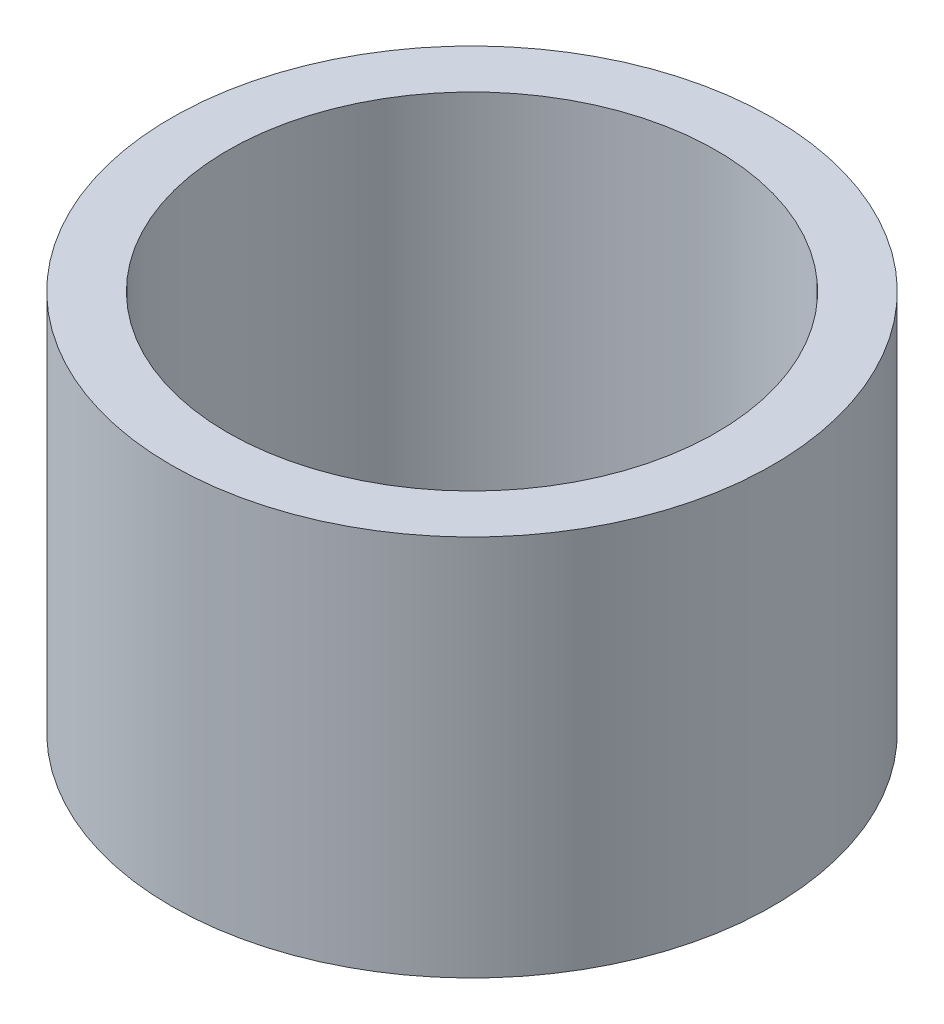
ISO-10303-21;
HEADER;
FILE_DESCRIPTION(('STEP AP214'),'2;1');
FILE_NAME('part.step','',(''),(''),'','','');
FILE_SCHEMA(('AUTOMOTIVE_DESIGN { 1 0 10303 214 1 1 1 1 }'));
ENDSEC;
DATA;
#1=APPLICATION_CONTEXT('core data for automotive mechanical design processes');
#2=APPLICATION_PROTOCOL_DEFINITION('international standard','automotive_design',2000,#1);
#3=PRODUCT_CONTEXT('',#1,'mechanical');
#4=PRODUCT('Part','Part','',(#3));
#5=PRODUCT_RELATED_PRODUCT_CATEGORY('part','',(#4));
#6=PRODUCT_DEFINITION_FORMATION('','',#4);
#7=PRODUCT_DEFINITION_CONTEXT('part definition',#1,'design');
#8=PRODUCT_DEFINITION('design','',#6,#7);
#9=PRODUCT_DEFINITION_SHAPE('','',#8);
#10=(LENGTH_UNIT() NAMED_UNIT(*) SI_UNIT(.MILLI.,.METRE.));
#11=(NAMED_UNIT(*) PLANE_ANGLE_UNIT() SI_UNIT($,.RADIAN.));
#12=(NAMED_UNIT(*) SI_UNIT($,.STERADIAN.) SOLID_ANGLE_UNIT());
#13=UNCERTAINTY_MEASURE_WITH_UNIT(LENGTH_MEASURE(1.E-05),#10,'distance_accuracy_value','');
#14=(GEOMETRIC_REPRESENTATION_CONTEXT(3) GLOBAL_UNCERTAINTY_ASSIGNED_CONTEXT((#13)) GLOBAL_UNIT_ASSIGNED_CONTEXT((#10,
#11,#12)) REPRESENTATION_CONTEXT('',''));
#15=CARTESIAN_POINT('',(0.,0.,0.));
#16=DIRECTION('',(0.,0.,1.));
#17=DIRECTION('',(1.,0.,0.));
#18=AXIS2_PLACEMENT_3D('',#15,#16,#17);
#19=CARTESIAN_POINT('',(0.,3.175,0.));
#20=DIRECTION('',(0.,1.,0.));
#21=DIRECTION('',(0.,0.,1.));
#22=AXIS2_PLACEMENT_3D('',#19,#20,#21);
#23=PLANE('',#22);
#24=CARTESIAN_POINT('',(0.,3.175,0.));
#25=DIRECTION('',(0.,1.,0.));
#26=DIRECTION('',(0.,0.,1.));
#27=AXIS2_PLACEMENT_3D('',#24,#25,#26);
#28=CIRCLE('',#27,5.);
#29=CARTESIAN_POINT('',(0.,3.175,5.));
#30=VERTEX_POINT('',#29);
#31=EDGE_CURVE('E10',#30,#30,#28,.T.);
#32=ORIENTED_EDGE('',*,*,#31,.T.);
#33=EDGE_LOOP('',(#32));
#34=FACE_BOUND('',#33,.T.);
#35=CARTESIAN_POINT('',(0.,3.175,0.));
#36=DIRECTION('',(0.,1.,0.));
#37=DIRECTION('',(0.,0.,1.));
#38=AXIS2_PLACEMENT_3D('',#35,#36,#37);
#39=CIRCLE('',#38,4.0635);
#40=CARTESIAN_POINT('',(0.,3.175,4.0635));
#41=VERTEX_POINT('',#40);
#42=EDGE_CURVE('E50',#41,#41,#39,.T.);
#43=ORIENTED_EDGE('',*,*,#42,.F.);
#44=EDGE_LOOP('',(#43));
#45=FACE_BOUND('',#44,.T.);
#46=ADVANCED_FACE('F37',(#34,#45),#23,.T.);
#47=CARTESIAN_POINT('',(0.,-3.175,0.));
#48=DIRECTION('',(0.,1.,0.));
#49=DIRECTION('',(0.,0.,1.));
#50=AXIS2_PLACEMENT_3D('',#47,#48,#49);
#51=PLANE('',#50);
#52=CARTESIAN_POINT('',(0.,-3.175,0.));
#53=DIRECTION('',(0.,1.,0.));
#54=DIRECTION('',(0.,0.,1.));
#55=AXIS2_PLACEMENT_3D('',#52,#53,#54);
#56=CIRCLE('',#55,5.);
#57=CARTESIAN_POINT('',(0.,-3.175,5.));
#58=VERTEX_POINT('',#57);
#59=EDGE_CURVE('E41',#58,#58,#56,.T.);
#60=ORIENTED_EDGE('',*,*,#59,.F.);
#61=EDGE_LOOP('',(#60));
#62=FACE_BOUND('',#61,.T.);
#63=CARTESIAN_POINT('',(0.,-3.175,0.));
#64=DIRECTION('',(0.,1.,0.));
#65=DIRECTION('',(0.,0.,1.));
#66=AXIS2_PLACEMENT_3D('',#63,#64,#65);
#67=CIRCLE('',#66,4.0635);
#68=CARTESIAN_POINT('',(0.,-3.175,4.0635));
#69=VERTEX_POINT('',#68);
#70=EDGE_CURVE('E52',#69,#69,#67,.T.);
#71=ORIENTED_EDGE('',*,*,#70,.T.);
#72=EDGE_LOOP('',(#71));
#73=FACE_BOUND('',#72,.T.);
#74=ADVANCED_FACE('F64',(#62,#73),#51,.F.);
#75=CARTESIAN_POINT('',(0.,3.175,0.));
#76=DIRECTION('',(0.,-1.,0.));
#77=DIRECTION('',(0.,0.,-1.));
#78=AXIS2_PLACEMENT_3D('',#75,#76,#77);
#79=CYLINDRICAL_SURFACE('',#78,5.);
#80=ORIENTED_EDGE('',*,*,#31,.F.);
#81=EDGE_LOOP('',(#80));
#82=FACE_BOUND('',#81,.T.);
#83=ORIENTED_EDGE('',*,*,#59,.T.);
#84=EDGE_LOOP('',(#83));
#85=FACE_BOUND('',#84,.T.);
#86=ADVANCED_FACE('F39',(#82,#85),#79,.T.);
#87=CARTESIAN_POINT('',(0.,3.175,0.));
#88=DIRECTION('',(0.,-1.,0.));
#89=DIRECTION('',(0.,0.,-1.));
#90=AXIS2_PLACEMENT_3D('',#87,#88,#89);
#91=CYLINDRICAL_SURFACE('',#90,4.0635);
#92=ORIENTED_EDGE('',*,*,#42,.T.);
#93=EDGE_LOOP('',(#92));
#94=FACE_BOUND('',#93,.T.);
#95=ORIENTED_EDGE('',*,*,#70,.F.);
#96=EDGE_LOOP('',(#95));
#97=FACE_BOUND('',#96,.T.);
#98=ADVANCED_FACE('F60',(#94,#97),#91,.F.);
#99=CLOSED_SHELL('',(#46,#74,#86,#98));
#100=MANIFOLD_SOLID_BREP('B2',#99);
#101=ADVANCED_BREP_SHAPE_REPRESENTATION('',(#18,#100),#14);
#102=SHAPE_DEFINITION_REPRESENTATION(#9,#101);
ENDSEC;
END-ISO-10303-21;
